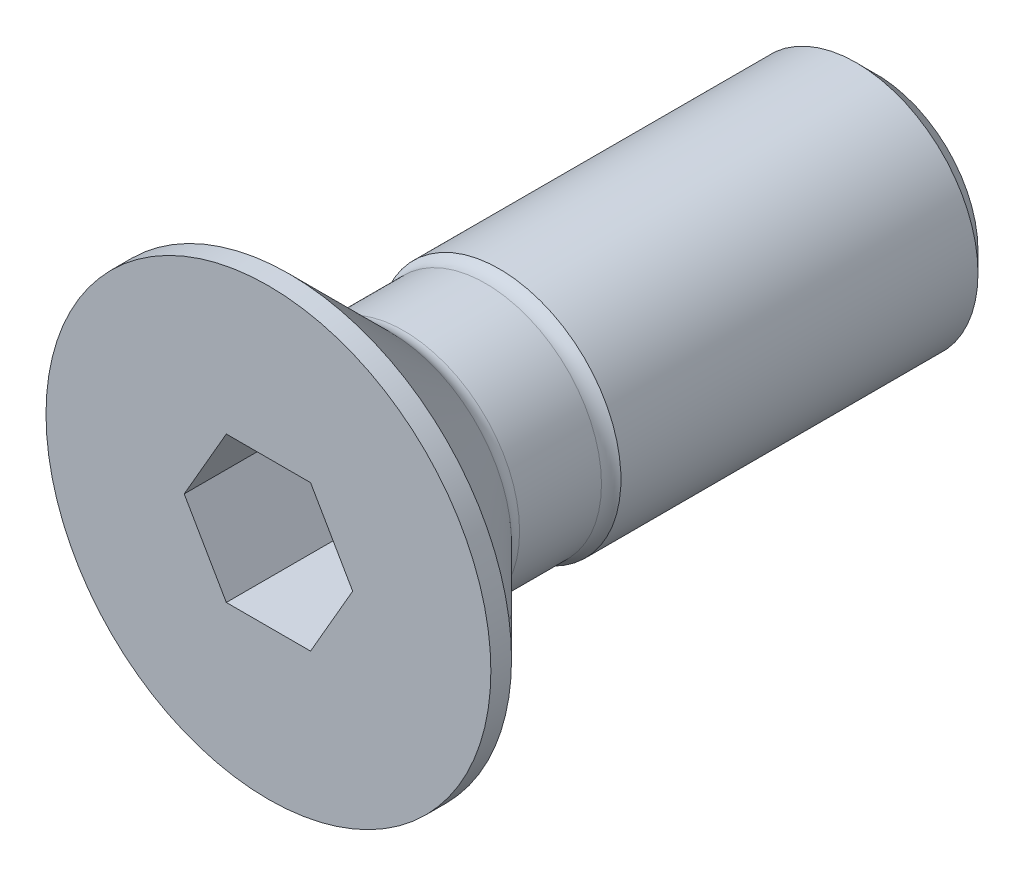
ISO-10303-21;
HEADER;
FILE_DESCRIPTION(('STEP AP214'),'2;1');
FILE_NAME('part.step','',(''),(''),'','','');
FILE_SCHEMA(('AUTOMOTIVE_DESIGN { 1 0 10303 214 1 1 1 1 }'));
ENDSEC;
DATA;
#1=APPLICATION_CONTEXT('core data for automotive mechanical design processes');
#2=APPLICATION_PROTOCOL_DEFINITION('international standard','automotive_design',2000,#1);
#3=PRODUCT_CONTEXT('',#1,'mechanical');
#4=PRODUCT('Part','Part','',(#3));
#5=PRODUCT_RELATED_PRODUCT_CATEGORY('part','',(#4));
#6=PRODUCT_DEFINITION_FORMATION('','',#4);
#7=PRODUCT_DEFINITION_CONTEXT('part definition',#1,'design');
#8=PRODUCT_DEFINITION('design','',#6,#7);
#9=PRODUCT_DEFINITION_SHAPE('','',#8);
#10=(LENGTH_UNIT() NAMED_UNIT(*) SI_UNIT(.MILLI.,.METRE.));
#11=(NAMED_UNIT(*) PLANE_ANGLE_UNIT() SI_UNIT($,.RADIAN.));
#12=(NAMED_UNIT(*) SI_UNIT($,.STERADIAN.) SOLID_ANGLE_UNIT());
#13=UNCERTAINTY_MEASURE_WITH_UNIT(LENGTH_MEASURE(1.E-05),#10,'distance_accuracy_value','');
#14=(GEOMETRIC_REPRESENTATION_CONTEXT(3) GLOBAL_UNCERTAINTY_ASSIGNED_CONTEXT((#13)) GLOBAL_UNIT_ASSIGNED_CONTEXT((#10,
#11,#12)) REPRESENTATION_CONTEXT('',''));
#15=CARTESIAN_POINT('',(0.,0.,0.));
#16=DIRECTION('',(0.,0.,1.));
#17=DIRECTION('',(1.,0.,0.));
#18=AXIS2_PLACEMENT_3D('',#15,#16,#17);
#19=CARTESIAN_POINT('',(0.,2.0940625,-25.));
#20=DIRECTION('',(0.,0.,-1.));
#21=DIRECTION('',(-1.,0.,0.));
#22=AXIS2_PLACEMENT_3D('',#19,#20,#21);
#23=PLANE('',#22);
#24=CARTESIAN_POINT('',(0.,0.,-24.9999999999772));
#25=DIRECTION('',(0.,0.,1.));
#26=DIRECTION('',(1.,0.,0.));
#27=AXIS2_PLACEMENT_3D('',#24,#25,#26);
#28=CIRCLE('',#27,4.18812499998469);
#29=CARTESIAN_POINT('',(4.18812499998469,0.,-24.9999999999772));
#30=VERTEX_POINT('',#29);
#31=EDGE_CURVE('E21',#30,#30,#28,.T.);
#32=ORIENTED_EDGE('',*,*,#31,.F.);
#33=EDGE_LOOP('',(#32));
#34=FACE_BOUND('',#33,.T.);
#35=ADVANCED_FACE('F17',(#34),#23,.T.);
#36=CARTESIAN_POINT('',(0.,0.,-24.1881250000802));
#37=DIRECTION('',(0.,0.,1.));
#38=DIRECTION('',(1.,0.,0.));
#39=AXIS2_PLACEMENT_3D('',#36,#37,#38);
#40=CONICAL_SURFACE('',#39,4.99999999988177,0.785398163397448);
#41=ORIENTED_EDGE('',*,*,#31,.T.);
#42=EDGE_LOOP('',(#41));
#43=FACE_BOUND('',#42,.T.);
#44=CARTESIAN_POINT('',(0.,0.,-24.188125));
#45=DIRECTION('',(0.,0.,-1.));
#46=DIRECTION('',(-1.,0.,0.));
#47=AXIS2_PLACEMENT_3D('',#44,#45,#46);
#48=CIRCLE('',#47,5.);
#49=CARTESIAN_POINT('',(-5.,0.,-24.188125));
#50=VERTEX_POINT('',#49);
#51=EDGE_CURVE('E155',#50,#50,#48,.F.);
#52=ORIENTED_EDGE('',*,*,#51,.F.);
#53=EDGE_LOOP('',(#52));
#54=FACE_BOUND('',#53,.T.);
#55=ADVANCED_FACE('F349',(#43,#54),#40,.T.);
#56=CARTESIAN_POINT('',(0.,0.,-16.8440625));
#57=DIRECTION('',(0.,0.,-1.));
#58=DIRECTION('',(-1.,0.,0.));
#59=AXIS2_PLACEMENT_3D('',#56,#57,#58);
#60=CYLINDRICAL_SURFACE('',#59,5.);
#61=ORIENTED_EDGE('',*,*,#51,.T.);
#62=EDGE_LOOP('',(#61));
#63=FACE_BOUND('',#62,.T.);
#64=CARTESIAN_POINT('',(0.,0.,-9.5));
#65=DIRECTION('',(0.,0.,-1.));
#66=DIRECTION('',(-1.,0.,0.));
#67=AXIS2_PLACEMENT_3D('',#64,#65,#66);
#68=CIRCLE('',#67,5.);
#69=CARTESIAN_POINT('',(-5.,0.,-9.5));
#70=VERTEX_POINT('',#69);
#71=EDGE_CURVE('E157',#70,#70,#68,.F.);
#72=ORIENTED_EDGE('',*,*,#71,.F.);
#73=EDGE_LOOP('',(#72));
#74=FACE_BOUND('',#73,.T.);
#75=ADVANCED_FACE('F261',(#63,#74),#60,.T.);
#76=CARTESIAN_POINT('',(0.,0.,-8.93431457505076));
#77=DIRECTION('',(0.,0.,-1.));
#78=DIRECTION('',(-1.,0.,0.));
#79=AXIS2_PLACEMENT_3D('',#76,#77,#78);
#80=TOROIDAL_SURFACE('',#79,5.56568542494924,0.8);
#81=CARTESIAN_POINT('',(0.,0.,-8.93431457505076));
#82=DIRECTION('',(0.,0.,-1.));
#83=DIRECTION('',(-1.,0.,0.));
#84=AXIS2_PLACEMENT_3D('',#81,#82,#83);
#85=CIRCLE('',#84,4.76568542494924);
#86=CARTESIAN_POINT('',(-4.76568542494924,0.,-8.93431457505076));
#87=VERTEX_POINT('',#86);
#88=EDGE_CURVE('E247',#87,#87,#85,.F.);
#89=ORIENTED_EDGE('',*,*,#88,.F.);
#90=EDGE_LOOP('',(#89));
#91=FACE_BOUND('',#90,.T.);
#92=ORIENTED_EDGE('',*,*,#71,.T.);
#93=EDGE_LOOP('',(#92));
#94=FACE_BOUND('',#93,.T.);
#95=ADVANCED_FACE('F258',(#91,#94),#80,.F.);
#96=CARTESIAN_POINT('',(0.,0.,-7.25));
#97=DIRECTION('',(0.,0.,-1.));
#98=DIRECTION('',(-1.,0.,0.));
#99=AXIS2_PLACEMENT_3D('',#96,#97,#98);
#100=CYLINDRICAL_SURFACE('',#99,4.76568542494924);
#101=ORIENTED_EDGE('',*,*,#88,.T.);
#102=EDGE_LOOP('',(#101));
#103=FACE_BOUND('',#102,.T.);
#104=CARTESIAN_POINT('',(0.,0.,-5.56568542494924));
#105=DIRECTION('',(0.,0.,-1.));
#106=DIRECTION('',(-1.,0.,0.));
#107=AXIS2_PLACEMENT_3D('',#104,#105,#106);
#108=CIRCLE('',#107,4.76568542494924);
#109=CARTESIAN_POINT('',(-4.76568542494924,0.,-5.56568542494924));
#110=VERTEX_POINT('',#109);
#111=EDGE_CURVE('E100',#110,#110,#108,.F.);
#112=ORIENTED_EDGE('',*,*,#111,.F.);
#113=EDGE_LOOP('',(#112));
#114=FACE_BOUND('',#113,.T.);
#115=ADVANCED_FACE('F243',(#103,#114),#100,.T.);
#116=CARTESIAN_POINT('',(0.,0.,-5.56568542494924));
#117=DIRECTION('',(0.,0.,-1.));
#118=DIRECTION('',(-1.,0.,0.));
#119=AXIS2_PLACEMENT_3D('',#116,#117,#118);
#120=TOROIDAL_SURFACE('',#119,5.56568542494924,0.8);
#121=CARTESIAN_POINT('',(0.,0.,-5.));
#122=DIRECTION('',(0.,0.,1.));
#123=DIRECTION('',(0.,1.,0.));
#124=AXIS2_PLACEMENT_3D('',#121,#122,#123);
#125=CIRCLE('',#124,5.);
#126=CARTESIAN_POINT('',(0.,5.,-5.));
#127=VERTEX_POINT('',#126);
#128=EDGE_CURVE('E82',#127,#127,#125,.T.);
#129=ORIENTED_EDGE('',*,*,#128,.F.);
#130=EDGE_LOOP('',(#129));
#131=FACE_BOUND('',#130,.T.);
#132=ORIENTED_EDGE('',*,*,#111,.T.);
#133=EDGE_LOOP('',(#132));
#134=FACE_BOUND('',#133,.T.);
#135=ADVANCED_FACE('F177',(#131,#134),#120,.F.);
#136=CARTESIAN_POINT('',(0.,0.,-4.48799688791723));
#137=DIRECTION('',(0.,0.,1.));
#138=DIRECTION('',(1.,0.,0.));
#139=AXIS2_PLACEMENT_3D('',#136,#137,#138);
#140=CONICAL_SURFACE('',#139,3.48578999995652,1.04719755119414);
#141=CARTESIAN_POINT('',(3.46499999999849,2.61771186116424E-12,-4.49999999998953));
#142=CARTESIAN_POINT('',(3.38886711739699,0.131866020795089,-4.543968082086));
#143=CARTESIAN_POINT('',(3.31207705683596,0.264870307203094,-4.58395475163481));
#144=CARTESIAN_POINT('',(3.15716736718157,0.533181760269221,-4.65375028236056));
#145=CARTESIAN_POINT('',(3.0790449865388,0.668493692750724,-4.68353445521944));
#146=CARTESIAN_POINT('',(2.92376835675468,0.937440704764892,-4.72989566757057));
#147=CARTESIAN_POINT('',(2.84663799222055,1.0710344149443,-4.74678130260269));
#148=CARTESIAN_POINT('',(2.69201452864804,1.33885010989417,-4.76693545725323));
#149=CARTESIAN_POINT('',(2.61452199123827,1.47307112189533,-4.77022067025826));
#150=CARTESIAN_POINT('',(2.46973549828742,1.72384868393591,-4.76336884948728));
#151=CARTESIAN_POINT('',(2.40241981635354,1.84044286519154,-4.75491416481397));
#152=CARTESIAN_POINT('',(2.26822699219562,2.07287165464422,-4.72812319535567));
#153=CARTESIAN_POINT('',(2.2013503137623,2.18870545953217,-4.70977776778506));
#154=CARTESIAN_POINT('',(2.06688103973125,2.42161307421085,-4.66391774961413));
#155=CARTESIAN_POINT('',(1.99930545444941,2.53865742127021,-4.63620885209383));
#156=CARTESIAN_POINT('',(1.86516188223422,2.77100090385569,-4.57332136906473));
#157=CARTESIAN_POINT('',(1.79859217809235,2.88630301367424,-4.53815755012685));
#158=CARTESIAN_POINT('',(1.73250000000151,3.00077802411046,-4.49999999998953));
#159=B_SPLINE_CURVE_WITH_KNOTS('',3,(#141,#142,#143,#144,#145,#146,#147,#148,#149,#150,#151,
#152,#153,#154,#155,#156,#157,#158),.UNSPECIFIED.,.F.,.F.,(4,2,2,2,2,2,2,2,4),(0.,
0.475647340386136,0.952437667989399,1.41742891187871,1.88184924817507,2.28615441464506,
2.69083395432299,3.1044873469865,3.51732891266231),.UNSPECIFIED.);
#160=CARTESIAN_POINT('',(3.46499999999924,-1.30917788284138E-12,-4.49999999998909));
#161=VERTEX_POINT('',#160);
#162=CARTESIAN_POINT('',(1.73249999999924,3.00077802411177,-4.49999999998953));
#163=VERTEX_POINT('',#162);
#164=EDGE_CURVE('E118',#161,#163,#159,.T.);
#165=ORIENTED_EDGE('',*,*,#164,.T.);
#166=CARTESIAN_POINT('',(1.73249999999698,3.00077802411308,-4.49999999998953));
#167=CARTESIAN_POINT('',(1.59027892903578,3.00077802411308,-4.5410599846732));
#168=CARTESIAN_POINT('',(1.44693276350651,3.00077802411308,-4.57865156046886));
#169=CARTESIAN_POINT('',(1.15791187349415,3.00077802411308,-4.64509000737535));
#170=CARTESIAN_POINT('',(1.01223269230139,3.00077802411308,-4.67391731274379));
#171=CARTESIAN_POINT('',(0.722508980407924,3.00077802411308,-4.72027510891853));
#172=CARTESIAN_POINT('',(0.578505240499617,3.00077802411308,-4.73805276011004));
#173=CARTESIAN_POINT('',(0.289666951367436,3.00077802411308,-4.76191820255258));
#174=CARTESIAN_POINT('',(0.144833475683718,3.00077802411308,-4.76801868273223));
#175=CARTESIAN_POINT('',(-0.144833475683718,3.00077802411308,-4.76801868273223));
#176=CARTESIAN_POINT('',(-0.289666951367436,3.00077802411308,-4.76191820255258));
#177=CARTESIAN_POINT('',(-0.578505240499617,3.00077802411308,-4.73805276011004));
#178=CARTESIAN_POINT('',(-0.722508980407923,3.00077802411308,-4.72027510891853));
#179=CARTESIAN_POINT('',(-1.01223269230139,3.00077802411308,-4.67391731274379));
#180=CARTESIAN_POINT('',(-1.15791187349415,3.00077802411308,-4.64509000737535));
#181=CARTESIAN_POINT('',(-1.44693276350651,3.00077802411308,-4.57865156046886));
#182=CARTESIAN_POINT('',(-1.59027892903578,3.00077802411308,-4.5410599846732));
#183=CARTESIAN_POINT('',(-1.73249999999698,3.00077802411308,-4.49999999998953));
#184=B_SPLINE_CURVE_WITH_KNOTS('',3,(#166,#167,#168,#169,#170,#171,#172,#173,#174,#175,#176,
#177,#178,#179,#180,#181,#182,#183),.UNSPECIFIED.,.F.,.F.,(4,2,2,2,2,2,2,2,4),(0.,
0.444225269949183,0.8894350865393,1.32428964269785,1.7586713978813,2.19305315306474,
2.62790770922329,3.07311752581341,3.51734279576259),.UNSPECIFIED.);
#185=CARTESIAN_POINT('',(-1.73249999999924,3.00077802411177,-4.49999999998953));
#186=VERTEX_POINT('',#185);
#187=EDGE_CURVE('E114',#163,#186,#184,.T.);
#188=ORIENTED_EDGE('',*,*,#187,.T.);
#189=CARTESIAN_POINT('',(-1.73250000000151,3.00077802411046,-4.49999999998953));
#190=CARTESIAN_POINT('',(-1.80863288260301,2.86891200331799,-4.543968082086));
#191=CARTESIAN_POINT('',(-1.88542294316404,2.73590771690999,-4.58395475163481));
#192=CARTESIAN_POINT('',(-2.04033263281843,2.46759626384386,-4.65375028236056));
#193=CARTESIAN_POINT('',(-2.1184550134612,2.33228433136236,-4.68353445521944));
#194=CARTESIAN_POINT('',(-2.27373164324532,2.06333731934819,-4.72989566757057));
#195=CARTESIAN_POINT('',(-2.35086200777944,1.92974360916878,-4.74678130260269));
#196=CARTESIAN_POINT('',(-2.50548547135196,1.66192791421891,-4.76693545725323));
#197=CARTESIAN_POINT('',(-2.58297800876173,1.52770690221775,-4.77022067025826));
#198=CARTESIAN_POINT('',(-2.72776450171258,1.27692934017717,-4.76336884948728));
#199=CARTESIAN_POINT('',(-2.79508018364646,1.16033515892154,-4.75491416481397));
#200=CARTESIAN_POINT('',(-2.92927300780438,0.927906369468862,-4.72812319535567));
#201=CARTESIAN_POINT('',(-2.9961496862377,0.81207256458091,-4.70977776778506));
#202=CARTESIAN_POINT('',(-3.13061896026875,0.57916494990223,-4.66391774961413));
#203=CARTESIAN_POINT('',(-3.19819454555059,0.462120602842875,-4.63620885209383));
#204=CARTESIAN_POINT('',(-3.33233811776578,0.229777120257386,-4.57332136906473));
#205=CARTESIAN_POINT('',(-3.39890782190765,0.114475010438842,-4.53815755012685));
#206=CARTESIAN_POINT('',(-3.46499999999849,2.61811792863809E-12,-4.49999999998953));
#207=B_SPLINE_CURVE_WITH_KNOTS('',3,(#189,#190,#191,#192,#193,#194,#195,#196,#197,#198,#199,
#200,#201,#202,#203,#204,#205,#206),.UNSPECIFIED.,.F.,.F.,(4,2,2,2,2,2,2,2,4),(0.,
0.475647340386135,0.952437667989399,1.41742891187871,1.88184924817507,2.28615441464506,
2.69083395432299,3.1044873469865,3.51732891266231),.UNSPECIFIED.);
#208=CARTESIAN_POINT('',(-3.46499999999849,0.,-4.49999999998953));
#209=VERTEX_POINT('',#208);
#210=EDGE_CURVE('E109',#186,#209,#207,.T.);
#211=ORIENTED_EDGE('',*,*,#210,.T.);
#212=CARTESIAN_POINT('',(-3.46499999999849,-2.61766510887489E-12,-4.49999999998953));
#213=CARTESIAN_POINT('',(-3.38886711739699,-0.131866020795089,-4.543968082086));
#214=CARTESIAN_POINT('',(-3.31207705683595,-0.264870307203094,-4.58395475163481));
#215=CARTESIAN_POINT('',(-3.15716736718157,-0.53318176026922,-4.65375028236056));
#216=CARTESIAN_POINT('',(-3.0790449865388,-0.668493692750724,-4.68353445521944));
#217=CARTESIAN_POINT('',(-2.92376835675468,-0.937440704764893,-4.72989566757057));
#218=CARTESIAN_POINT('',(-2.84663799222055,-1.0710344149443,-4.74678130260269));
#219=CARTESIAN_POINT('',(-2.69201452864804,-1.33885010989417,-4.76693545725323));
#220=CARTESIAN_POINT('',(-2.61452199123827,-1.47307112189533,-4.77022067025826));
#221=CARTESIAN_POINT('',(-2.46973549828742,-1.72384868393591,-4.76336884948728));
#222=CARTESIAN_POINT('',(-2.40241981635354,-1.84044286519154,-4.75491416481397));
#223=CARTESIAN_POINT('',(-2.26822699219562,-2.07287165464422,-4.72812319535567));
#224=CARTESIAN_POINT('',(-2.2013503137623,-2.18870545953217,-4.70977776778506));
#225=CARTESIAN_POINT('',(-2.06688103973125,-2.42161307421085,-4.66391774961413));
#226=CARTESIAN_POINT('',(-1.99930545444941,-2.5386574212702,-4.63620885209383));
#227=CARTESIAN_POINT('',(-1.86516188223422,-2.77100090385569,-4.57332136906473));
#228=CARTESIAN_POINT('',(-1.79859217809235,-2.88630301367424,-4.53815755012685));
#229=CARTESIAN_POINT('',(-1.73250000000151,-3.00077802411046,-4.49999999998953));
#230=B_SPLINE_CURVE_WITH_KNOTS('',3,(#212,#213,#214,#215,#216,#217,#218,#219,#220,#221,#222,
#223,#224,#225,#226,#227,#228,#229),.UNSPECIFIED.,.F.,.F.,(4,2,2,2,2,2,2,2,4),(0.,
0.475647340386135,0.952437667989399,1.41742891187871,1.88184924817507,2.28615441464506,
2.69083395432299,3.10448734698649,3.51732891266231),.UNSPECIFIED.);
#231=CARTESIAN_POINT('',(-1.73249999999925,-3.00077802411177,-4.49999999998953));
#232=VERTEX_POINT('',#231);
#233=EDGE_CURVE('E88',#209,#232,#230,.T.);
#234=ORIENTED_EDGE('',*,*,#233,.T.);
#235=CARTESIAN_POINT('',(-1.73249999999698,-3.00077802411308,-4.49999999998953));
#236=CARTESIAN_POINT('',(-1.59027892903578,-3.00077802411308,-4.5410599846732));
#237=CARTESIAN_POINT('',(-1.44693276350651,-3.00077802411308,-4.57865156046886));
#238=CARTESIAN_POINT('',(-1.15791187349415,-3.00077802411308,-4.64509000737535));
#239=CARTESIAN_POINT('',(-1.01223269230139,-3.00077802411308,-4.67391731274379));
#240=CARTESIAN_POINT('',(-0.722508980407924,-3.00077802411308,-4.72027510891853));
#241=CARTESIAN_POINT('',(-0.578505240499617,-3.00077802411308,-4.73805276011004));
#242=CARTESIAN_POINT('',(-0.289666951367436,-3.00077802411308,-4.76191820255258));
#243=CARTESIAN_POINT('',(-0.144833475683718,-3.00077802411308,-4.76801868273223));
#244=CARTESIAN_POINT('',(0.144833475683718,-3.00077802411308,-4.76801868273223));
#245=CARTESIAN_POINT('',(0.289666951367437,-3.00077802411308,-4.76191820255258));
#246=CARTESIAN_POINT('',(0.578505240499617,-3.00077802411308,-4.73805276011004));
#247=CARTESIAN_POINT('',(0.722508980407924,-3.00077802411308,-4.72027510891853));
#248=CARTESIAN_POINT('',(1.01223269230139,-3.00077802411308,-4.67391731274379));
#249=CARTESIAN_POINT('',(1.15791187349415,-3.00077802411308,-4.64509000737535));
#250=CARTESIAN_POINT('',(1.44693276350651,-3.00077802411308,-4.57865156046886));
#251=CARTESIAN_POINT('',(1.59027892903578,-3.00077802411308,-4.5410599846732));
#252=CARTESIAN_POINT('',(1.73249999999698,-3.00077802411308,-4.49999999998953));
#253=B_SPLINE_CURVE_WITH_KNOTS('',3,(#235,#236,#237,#238,#239,#240,#241,#242,#243,#244,#245,
#246,#247,#248,#249,#250,#251,#252),.UNSPECIFIED.,.F.,.F.,(4,2,2,2,2,2,2,2,4),(0.,
0.444225269949183,0.8894350865393,1.32428964269785,1.7586713978813,2.19305315306474,
2.62790770922329,3.07311752581341,3.51734279576259),.UNSPECIFIED.);
#254=CARTESIAN_POINT('',(1.73249999999924,-3.00077802411177,-4.49999999998953));
#255=VERTEX_POINT('',#254);
#256=EDGE_CURVE('E84',#232,#255,#253,.T.);
#257=ORIENTED_EDGE('',*,*,#256,.T.);
#258=CARTESIAN_POINT('',(1.73250000000151,-3.00077802411046,-4.49999999998953));
#259=CARTESIAN_POINT('',(1.80863288260301,-2.86891200331799,-4.543968082086));
#260=CARTESIAN_POINT('',(1.88542294316405,-2.73590771690999,-4.58395475163481));
#261=CARTESIAN_POINT('',(2.04033263281843,-2.46759626384386,-4.65375028236056));
#262=CARTESIAN_POINT('',(2.1184550134612,-2.33228433136236,-4.68353445521944));
#263=CARTESIAN_POINT('',(2.27373164324532,-2.06333731934819,-4.72989566757057));
#264=CARTESIAN_POINT('',(2.35086200777945,-1.92974360916878,-4.74678130260269));
#265=CARTESIAN_POINT('',(2.50548547135196,-1.66192791421891,-4.76693545725323));
#266=CARTESIAN_POINT('',(2.58297800876173,-1.52770690221775,-4.77022067025826));
#267=CARTESIAN_POINT('',(2.72776450171258,-1.27692934017717,-4.76336884948728));
#268=CARTESIAN_POINT('',(2.79508018364646,-1.16033515892154,-4.75491416481397));
#269=CARTESIAN_POINT('',(2.92927300780439,-0.927906369468861,-4.72812319535567));
#270=CARTESIAN_POINT('',(2.9961496862377,-0.81207256458091,-4.70977776778506));
#271=CARTESIAN_POINT('',(3.13061896026875,-0.57916494990223,-4.66391774961413));
#272=CARTESIAN_POINT('',(3.19819454555059,-0.462120602842875,-4.63620885209383));
#273=CARTESIAN_POINT('',(3.33233811776578,-0.229777120257386,-4.57332136906473));
#274=CARTESIAN_POINT('',(3.39890782190765,-0.114475010438842,-4.53815755012685));
#275=CARTESIAN_POINT('',(3.46499999999849,-2.61825516557252E-12,-4.49999999998953));
#276=B_SPLINE_CURVE_WITH_KNOTS('',3,(#258,#259,#260,#261,#262,#263,#264,#265,#266,#267,#268,
#269,#270,#271,#272,#273,#274,#275),.UNSPECIFIED.,.F.,.F.,(4,2,2,2,2,2,2,2,4),(0.,
0.475647340386136,0.952437667989399,1.41742891187871,1.88184924817507,2.28615441464506,
2.69083395432299,3.1044873469865,3.51732891266231),.UNSPECIFIED.);
#277=EDGE_CURVE('E70',#255,#161,#276,.T.);
#278=ORIENTED_EDGE('',*,*,#277,.T.);
#279=EDGE_LOOP('',(#165,#188,#211,#234,#257,#278));
#280=FACE_BOUND('',#279,.T.);
#281=CARTESIAN_POINT('',(0.,1.13686837721616E-10,-6.50051868274204));
#282=VERTEX_POINT('',#281);
#283=VERTEX_LOOP('',#282);
#284=FACE_BOUND('',#283,.T.);
#285=ADVANCED_FACE('F85',(#280,#284),#140,.F.);
#286=CARTESIAN_POINT('',(0.,0.,-0.85));
#287=DIRECTION('',(0.,0.,1.));
#288=DIRECTION('',(1.,0.,0.));
#289=AXIS2_PLACEMENT_3D('',#286,#287,#288);
#290=CONICAL_SURFACE('',#289,9.15,0.785398163397448);
#291=ORIENTED_EDGE('',*,*,#128,.T.);
#292=EDGE_LOOP('',(#291));
#293=FACE_BOUND('',#292,.T.);
#294=CARTESIAN_POINT('',(0.,0.,-0.849999999999999));
#295=DIRECTION('',(0.,0.,-1.));
#296=DIRECTION('',(-1.,0.,0.));
#297=AXIS2_PLACEMENT_3D('',#294,#295,#296);
#298=CIRCLE('',#297,9.15);
#299=CARTESIAN_POINT('',(-9.15,0.,-0.849999999999999));
#300=VERTEX_POINT('',#299);
#301=EDGE_CURVE('E124',#300,#300,#298,.F.);
#302=ORIENTED_EDGE('',*,*,#301,.F.);
#303=EDGE_LOOP('',(#302));
#304=FACE_BOUND('',#303,.T.);
#305=ADVANCED_FACE('F176',(#293,#304),#290,.T.);
#306=CARTESIAN_POINT('',(1.7325,-3.00077802411308,0.));
#307=DIRECTION('',(0.866025403784439,-0.5,0.));
#308=DIRECTION('',(0.5,0.866025403784439,0.));
#309=AXIS2_PLACEMENT_3D('',#306,#307,#308);
#310=PLANE('',#309);
#311=DIRECTION('',(0.,0.,1.));
#312=VECTOR('',#311,1.);
#313=CARTESIAN_POINT('',(1.7325,-3.00077802411308,0.));
#314=LINE('',#313,#312);
#315=CARTESIAN_POINT('',(1.7325,-3.00077802411308,0.));
#316=VERTEX_POINT('',#315);
#317=EDGE_CURVE('E75',#255,#316,#314,.T.);
#318=ORIENTED_EDGE('',*,*,#317,.T.);
#319=DIRECTION('',(-0.5,-0.866025403784438,0.));
#320=VECTOR('',#319,1.);
#321=CARTESIAN_POINT('',(3.465,0.,0.));
#322=LINE('',#321,#320);
#323=CARTESIAN_POINT('',(3.465,0.,0.));
#324=VERTEX_POINT('',#323);
#325=EDGE_CURVE('E127',#324,#316,#322,.T.);
#326=ORIENTED_EDGE('',*,*,#325,.F.);
#327=DIRECTION('',(0.,0.,1.));
#328=VECTOR('',#327,1.);
#329=CARTESIAN_POINT('',(3.465,0.,0.));
#330=LINE('',#329,#328);
#331=EDGE_CURVE('E78',#324,#161,#330,.F.);
#332=ORIENTED_EDGE('',*,*,#331,.T.);
#333=ORIENTED_EDGE('',*,*,#277,.F.);
#334=EDGE_LOOP('',(#318,#326,#332,#333));
#335=FACE_BOUND('',#334,.T.);
#336=ADVANCED_FACE('F72',(#335),#310,.F.);
#337=CARTESIAN_POINT('',(-1.7325,-3.00077802411308,0.));
#338=DIRECTION('',(0.,-1.,0.));
#339=DIRECTION('',(1.,0.,0.));
#340=AXIS2_PLACEMENT_3D('',#337,#338,#339);
#341=PLANE('',#340);
#342=ORIENTED_EDGE('',*,*,#256,.F.);
#343=DIRECTION('',(0.,0.,1.));
#344=VECTOR('',#343,1.);
#345=CARTESIAN_POINT('',(-1.7325,-3.00077802411308,0.));
#346=LINE('',#345,#344);
#347=CARTESIAN_POINT('',(-1.7325,-3.00077802411308,0.));
#348=VERTEX_POINT('',#347);
#349=EDGE_CURVE('E91',#232,#348,#346,.T.);
#350=ORIENTED_EDGE('',*,*,#349,.T.);
#351=DIRECTION('',(1.,0.,0.));
#352=VECTOR('',#351,1.);
#353=CARTESIAN_POINT('',(0.,-3.00077802411308,0.));
#354=LINE('',#353,#352);
#355=EDGE_CURVE('E95',#316,#348,#354,.F.);
#356=ORIENTED_EDGE('',*,*,#355,.F.);
#357=ORIENTED_EDGE('',*,*,#317,.F.);
#358=EDGE_LOOP('',(#342,#350,#356,#357));
#359=FACE_BOUND('',#358,.T.);
#360=ADVANCED_FACE('F93',(#359),#341,.F.);
#361=CARTESIAN_POINT('',(-3.465,0.,0.));
#362=DIRECTION('',(-0.866025403784439,-0.5,0.));
#363=DIRECTION('',(0.5,-0.866025403784439,0.));
#364=AXIS2_PLACEMENT_3D('',#361,#362,#363);
#365=PLANE('',#364);
#366=DIRECTION('',(0.,0.,1.));
#367=VECTOR('',#366,1.);
#368=CARTESIAN_POINT('',(-3.465,0.,0.));
#369=LINE('',#368,#367);
#370=CARTESIAN_POINT('',(-3.465,0.,0.));
#371=VERTEX_POINT('',#370);
#372=EDGE_CURVE('E107',#209,#371,#369,.T.);
#373=ORIENTED_EDGE('',*,*,#372,.T.);
#374=DIRECTION('',(-0.5,0.866025403784439,0.));
#375=VECTOR('',#374,1.);
#376=CARTESIAN_POINT('',(-1.7325,-3.00077802411308,0.));
#377=LINE('',#376,#375);
#378=EDGE_CURVE('E143',#348,#371,#377,.T.);
#379=ORIENTED_EDGE('',*,*,#378,.F.);
#380=ORIENTED_EDGE('',*,*,#349,.F.);
#381=ORIENTED_EDGE('',*,*,#233,.F.);
#382=EDGE_LOOP('',(#373,#379,#380,#381));
#383=FACE_BOUND('',#382,.T.);
#384=ADVANCED_FACE('F198',(#383),#365,.F.);
#385=CARTESIAN_POINT('',(-1.7325,3.00077802411308,0.));
#386=DIRECTION('',(-0.866025403784438,0.5,0.));
#387=DIRECTION('',(-0.5,-0.866025403784439,0.));
#388=AXIS2_PLACEMENT_3D('',#385,#386,#387);
#389=PLANE('',#388);
#390=DIRECTION('',(0.,0.,1.));
#391=VECTOR('',#390,1.);
#392=CARTESIAN_POINT('',(-1.7325,3.00077802411308,0.));
#393=LINE('',#392,#391);
#394=CARTESIAN_POINT('',(-1.7325,3.00077802411308,0.));
#395=VERTEX_POINT('',#394);
#396=EDGE_CURVE('E112',#186,#395,#393,.T.);
#397=ORIENTED_EDGE('',*,*,#396,.T.);
#398=DIRECTION('',(0.5,0.866025403784439,0.));
#399=VECTOR('',#398,1.);
#400=CARTESIAN_POINT('',(-3.465,0.,0.));
#401=LINE('',#400,#399);
#402=EDGE_CURVE('E138',#371,#395,#401,.T.);
#403=ORIENTED_EDGE('',*,*,#402,.F.);
#404=ORIENTED_EDGE('',*,*,#372,.F.);
#405=ORIENTED_EDGE('',*,*,#210,.F.);
#406=EDGE_LOOP('',(#397,#403,#404,#405));
#407=FACE_BOUND('',#406,.T.);
#408=ADVANCED_FACE('F201',(#407),#389,.F.);
#409=CARTESIAN_POINT('',(1.7325,3.00077802411308,0.));
#410=DIRECTION('',(0.,1.,0.));
#411=DIRECTION('',(0.,0.,1.));
#412=AXIS2_PLACEMENT_3D('',#409,#410,#411);
#413=PLANE('',#412);
#414=ORIENTED_EDGE('',*,*,#187,.F.);
#415=DIRECTION('',(0.,0.,1.));
#416=VECTOR('',#415,1.);
#417=CARTESIAN_POINT('',(1.7325,3.00077802411308,0.));
#418=LINE('',#417,#416);
#419=CARTESIAN_POINT('',(1.7325,3.00077802411308,0.));
#420=VERTEX_POINT('',#419);
#421=EDGE_CURVE('E36',#163,#420,#418,.T.);
#422=ORIENTED_EDGE('',*,*,#421,.T.);
#423=DIRECTION('',(1.,0.,0.));
#424=VECTOR('',#423,1.);
#425=CARTESIAN_POINT('',(0.,3.00077802411308,0.));
#426=LINE('',#425,#424);
#427=EDGE_CURVE('E133',#395,#420,#426,.T.);
#428=ORIENTED_EDGE('',*,*,#427,.F.);
#429=ORIENTED_EDGE('',*,*,#396,.F.);
#430=EDGE_LOOP('',(#414,#422,#428,#429));
#431=FACE_BOUND('',#430,.T.);
#432=ADVANCED_FACE('F206',(#431),#413,.F.);
#433=CARTESIAN_POINT('',(3.465,0.,0.));
#434=DIRECTION('',(0.866025403784439,0.5,0.));
#435=DIRECTION('',(-0.5,0.866025403784439,0.));
#436=AXIS2_PLACEMENT_3D('',#433,#434,#435);
#437=PLANE('',#436);
#438=ORIENTED_EDGE('',*,*,#331,.F.);
#439=DIRECTION('',(0.5,-0.866025403784439,0.));
#440=VECTOR('',#439,1.);
#441=CARTESIAN_POINT('',(1.7325,3.00077802411308,0.));
#442=LINE('',#441,#440);
#443=EDGE_CURVE('E27',#420,#324,#442,.T.);
#444=ORIENTED_EDGE('',*,*,#443,.F.);
#445=ORIENTED_EDGE('',*,*,#421,.F.);
#446=ORIENTED_EDGE('',*,*,#164,.F.);
#447=EDGE_LOOP('',(#438,#444,#445,#446));
#448=FACE_BOUND('',#447,.T.);
#449=ADVANCED_FACE('F170',(#448),#437,.F.);
#450=CARTESIAN_POINT('',(0.,0.,-0.424999999999999));
#451=DIRECTION('',(0.,0.,-1.));
#452=DIRECTION('',(-1.,0.,0.));
#453=AXIS2_PLACEMENT_3D('',#450,#451,#452);
#454=CYLINDRICAL_SURFACE('',#453,9.15);
#455=ORIENTED_EDGE('',*,*,#301,.T.);
#456=EDGE_LOOP('',(#455));
#457=FACE_BOUND('',#456,.T.);
#458=CARTESIAN_POINT('',(0.,0.,0.));
#459=DIRECTION('',(0.,0.,-1.));
#460=DIRECTION('',(-1.,0.,0.));
#461=AXIS2_PLACEMENT_3D('',#458,#459,#460);
#462=CIRCLE('',#461,9.15);
#463=CARTESIAN_POINT('',(-9.15,0.,0.));
#464=VERTEX_POINT('',#463);
#465=EDGE_CURVE('E11',#464,#464,#462,.F.);
#466=ORIENTED_EDGE('',*,*,#465,.F.);
#467=EDGE_LOOP('',(#466));
#468=FACE_BOUND('',#467,.T.);
#469=ADVANCED_FACE('F214',(#457,#468),#454,.T.);
#470=CARTESIAN_POINT('',(0.,4.575,0.));
#471=DIRECTION('',(0.,0.,1.));
#472=DIRECTION('',(0.,-1.,0.));
#473=AXIS2_PLACEMENT_3D('',#470,#471,#472);
#474=PLANE('',#473);
#475=ORIENTED_EDGE('',*,*,#465,.T.);
#476=EDGE_LOOP('',(#475));
#477=FACE_BOUND('',#476,.T.);
#478=ORIENTED_EDGE('',*,*,#427,.T.);
#479=ORIENTED_EDGE('',*,*,#443,.T.);
#480=ORIENTED_EDGE('',*,*,#325,.T.);
#481=ORIENTED_EDGE('',*,*,#355,.T.);
#482=ORIENTED_EDGE('',*,*,#378,.T.);
#483=ORIENTED_EDGE('',*,*,#402,.T.);
#484=EDGE_LOOP('',(#478,#479,#480,#481,#482,#483));
#485=FACE_BOUND('',#484,.T.);
#486=ADVANCED_FACE('F19',(#477,#485),#474,.T.);
#487=CLOSED_SHELL('',(#35,#55,#75,#95,#115,#135,#285,#305,#336,#360,#384,#408,#432,#449,#469,#486));
#488=MANIFOLD_SOLID_BREP('B1',#487);
#489=ADVANCED_BREP_SHAPE_REPRESENTATION('',(#18,#488),#14);
#490=SHAPE_DEFINITION_REPRESENTATION(#9,#489);
ENDSEC;
END-ISO-10303-21;
